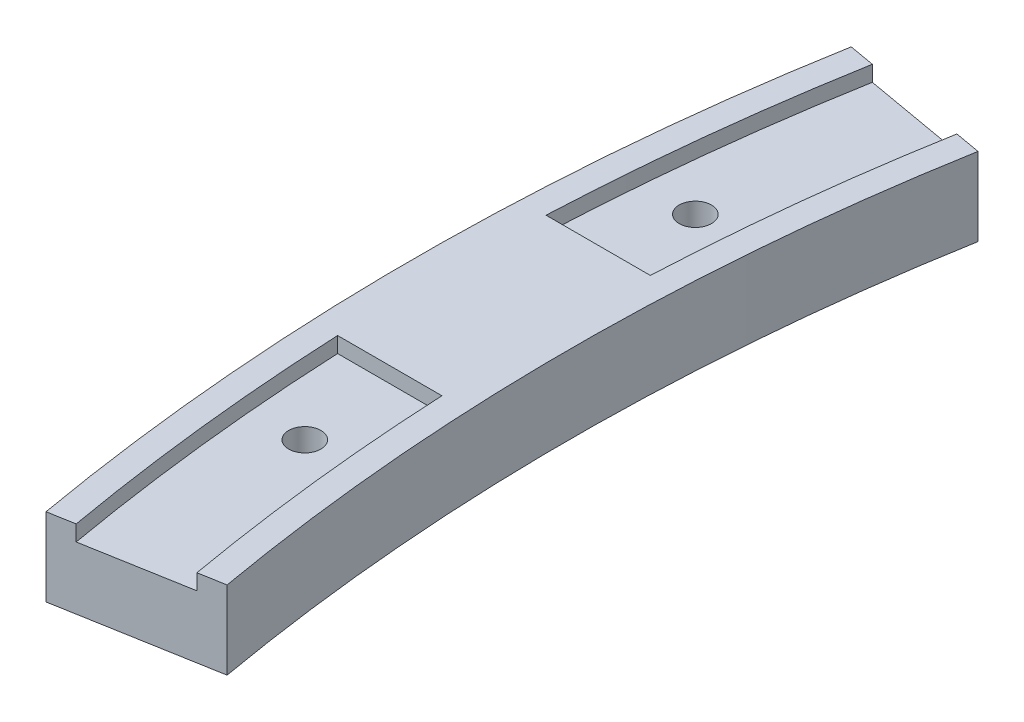
ISO-10303-21;
HEADER;
FILE_DESCRIPTION(('STEP AP214'),'2;1');
FILE_NAME('part.step','',(''),(''),'','','');
FILE_SCHEMA(('AUTOMOTIVE_DESIGN { 1 0 10303 214 1 1 1 1 }'));
ENDSEC;
DATA;
#1=APPLICATION_CONTEXT('core data for automotive mechanical design processes');
#2=APPLICATION_PROTOCOL_DEFINITION('international standard','automotive_design',2000,#1);
#3=PRODUCT_CONTEXT('',#1,'mechanical');
#4=PRODUCT('Part','Part','',(#3));
#5=PRODUCT_RELATED_PRODUCT_CATEGORY('part','',(#4));
#6=PRODUCT_DEFINITION_FORMATION('','',#4);
#7=PRODUCT_DEFINITION_CONTEXT('part definition',#1,'design');
#8=PRODUCT_DEFINITION('design','',#6,#7);
#9=PRODUCT_DEFINITION_SHAPE('','',#8);
#10=(LENGTH_UNIT() NAMED_UNIT(*) SI_UNIT(.MILLI.,.METRE.));
#11=(NAMED_UNIT(*) PLANE_ANGLE_UNIT() SI_UNIT($,.RADIAN.));
#12=(NAMED_UNIT(*) SI_UNIT($,.STERADIAN.) SOLID_ANGLE_UNIT());
#13=UNCERTAINTY_MEASURE_WITH_UNIT(LENGTH_MEASURE(1.E-05),#10,'distance_accuracy_value','');
#14=(GEOMETRIC_REPRESENTATION_CONTEXT(3) GLOBAL_UNCERTAINTY_ASSIGNED_CONTEXT((#13)) GLOBAL_UNIT_ASSIGNED_CONTEXT((#10,
#11,#12)) REPRESENTATION_CONTEXT('',''));
#15=CARTESIAN_POINT('',(0.,0.,0.));
#16=DIRECTION('',(0.,0.,1.));
#17=DIRECTION('',(1.,0.,0.));
#18=AXIS2_PLACEMENT_3D('',#15,#16,#17);
#19=CARTESIAN_POINT('',(-204.347608750033,7.5,36.0319968658881));
#20=DIRECTION('',(-0.173648177666931,0.,-0.984807753012208));
#21=DIRECTION('',(-0.984807753012208,0.,0.173648177666931));
#22=AXIS2_PLACEMENT_3D('',#19,#20,#21);
#23=PLANE('',#22);
#24=DIRECTION('',(0.,1.,0.));
#25=VECTOR('',#24,1.);
#26=CARTESIAN_POINT('',(-206.809628132564,6.,36.4661173100556));
#27=LINE('',#26,#25);
#28=CARTESIAN_POINT('',(-206.809628132564,6.,36.4661173100556));
#29=VERTEX_POINT('',#28);
#30=CARTESIAN_POINT('',(-206.809628132564,7.5,36.4661173100556));
#31=VERTEX_POINT('',#30);
#32=EDGE_CURVE('E158',#29,#31,#27,.T.);
#33=ORIENTED_EDGE('',*,*,#32,.F.);
#34=DIRECTION('',(0.984807753012208,0.,-0.173648177666931));
#35=VECTOR('',#34,1.);
#36=CARTESIAN_POINT('',(0.,6.,0.));
#37=LINE('',#36,#35);
#38=CARTESIAN_POINT('',(-216.657705662686,6.,38.2025990867249));
#39=VERTEX_POINT('',#38);
#40=EDGE_CURVE('E176',#39,#29,#37,.T.);
#41=ORIENTED_EDGE('',*,*,#40,.F.);
#42=DIRECTION('',(0.,1.,0.));
#43=VECTOR('',#42,1.);
#44=CARTESIAN_POINT('',(-216.657705662686,6.,38.2025990867249));
#45=LINE('',#44,#43);
#46=CARTESIAN_POINT('',(-216.657705662686,7.5,38.2025990867249));
#47=VERTEX_POINT('',#46);
#48=EDGE_CURVE('E186',#39,#47,#45,.T.);
#49=ORIENTED_EDGE('',*,*,#48,.T.);
#50=DIRECTION('',(0.984807753012208,0.,-0.173648177666931));
#51=VECTOR('',#50,1.);
#52=CARTESIAN_POINT('',(-204.347608750033,7.5,36.0319968658881));
#53=LINE('',#52,#51);
#54=CARTESIAN_POINT('',(-219.119725045216,7.5,38.6367195308921));
#55=VERTEX_POINT('',#54);
#56=EDGE_CURVE('E197',#55,#47,#53,.T.);
#57=ORIENTED_EDGE('',*,*,#56,.F.);
#58=DIRECTION('',(0.,-1.,0.));
#59=VECTOR('',#58,1.);
#60=CARTESIAN_POINT('',(-219.119725045216,7.5,38.6367195308921));
#61=LINE('',#60,#59);
#62=CARTESIAN_POINT('',(-219.119725045216,0.,38.6367195308921));
#63=VERTEX_POINT('',#62);
#64=EDGE_CURVE('E11',#55,#63,#61,.T.);
#65=ORIENTED_EDGE('',*,*,#64,.T.);
#66=DIRECTION('',(0.984807753012208,0.,-0.173648177666931));
#67=VECTOR('',#66,1.);
#68=CARTESIAN_POINT('',(-204.347608750033,0.,36.0319968658881));
#69=LINE('',#68,#67);
#70=CARTESIAN_POINT('',(-204.347608750033,0.,36.0319968658881));
#71=VERTEX_POINT('',#70);
#72=EDGE_CURVE('E208',#63,#71,#69,.T.);
#73=ORIENTED_EDGE('',*,*,#72,.T.);
#74=DIRECTION('',(0.,-1.,0.));
#75=VECTOR('',#74,1.);
#76=CARTESIAN_POINT('',(-204.347608750033,7.5,36.0319968658881));
#77=LINE('',#76,#75);
#78=CARTESIAN_POINT('',(-204.347608750033,7.5,36.0319968658881));
#79=VERTEX_POINT('',#78);
#80=EDGE_CURVE('E44',#79,#71,#77,.T.);
#81=ORIENTED_EDGE('',*,*,#80,.F.);
#82=EDGE_CURVE('E195',#31,#79,#53,.T.);
#83=ORIENTED_EDGE('',*,*,#82,.F.);
#84=EDGE_LOOP('',(#33,#41,#49,#57,#65,#73,#81,#83));
#85=FACE_BOUND('',#84,.T.);
#86=ADVANCED_FACE('F35',(#85),#23,.F.);
#87=CARTESIAN_POINT('',(-219.119725045216,7.5,-38.6367195308921));
#88=DIRECTION('',(-0.173648177666931,0.,0.984807753012208));
#89=DIRECTION('',(0.984807753012208,0.,0.173648177666931));
#90=AXIS2_PLACEMENT_3D('',#87,#88,#89);
#91=PLANE('',#90);
#92=DIRECTION('',(0.,1.,0.));
#93=VECTOR('',#92,1.);
#94=CARTESIAN_POINT('',(-206.809628132564,6.,-36.4661173100556));
#95=LINE('',#94,#93);
#96=CARTESIAN_POINT('',(-206.809628132564,6.,-36.4661173100556));
#97=VERTEX_POINT('',#96);
#98=CARTESIAN_POINT('',(-206.809628132564,7.5,-36.4661173100556));
#99=VERTEX_POINT('',#98);
#100=EDGE_CURVE('E127',#97,#99,#95,.T.);
#101=ORIENTED_EDGE('',*,*,#100,.T.);
#102=DIRECTION('',(-0.984807753012208,0.,-0.173648177666931));
#103=VECTOR('',#102,1.);
#104=CARTESIAN_POINT('',(-219.119725045216,7.5,-38.6367195308921));
#105=LINE('',#104,#103);
#106=CARTESIAN_POINT('',(-204.347608750033,7.5,-36.0319968658881));
#107=VERTEX_POINT('',#106);
#108=EDGE_CURVE('E203',#107,#99,#105,.T.);
#109=ORIENTED_EDGE('',*,*,#108,.F.);
#110=DIRECTION('',(0.,-1.,0.));
#111=VECTOR('',#110,1.);
#112=CARTESIAN_POINT('',(-204.347608750033,7.5,-36.0319968658881));
#113=LINE('',#112,#111);
#114=CARTESIAN_POINT('',(-204.347608750033,0.,-36.0319968658881));
#115=VERTEX_POINT('',#114);
#116=EDGE_CURVE('E215',#107,#115,#113,.T.);
#117=ORIENTED_EDGE('',*,*,#116,.T.);
#118=DIRECTION('',(-0.984807753012208,0.,-0.173648177666931));
#119=VECTOR('',#118,1.);
#120=CARTESIAN_POINT('',(-219.119725045216,0.,-38.6367195308921));
#121=LINE('',#120,#119);
#122=CARTESIAN_POINT('',(-219.119725045216,0.,-38.6367195308921));
#123=VERTEX_POINT('',#122);
#124=EDGE_CURVE('E196',#115,#123,#121,.T.);
#125=ORIENTED_EDGE('',*,*,#124,.T.);
#126=DIRECTION('',(0.,-1.,0.));
#127=VECTOR('',#126,1.);
#128=CARTESIAN_POINT('',(-219.119725045216,7.5,-38.6367195308921));
#129=LINE('',#128,#127);
#130=CARTESIAN_POINT('',(-219.119725045216,7.5,-38.6367195308921));
#131=VERTEX_POINT('',#130);
#132=EDGE_CURVE('E205',#131,#123,#129,.T.);
#133=ORIENTED_EDGE('',*,*,#132,.F.);
#134=CARTESIAN_POINT('',(-216.657705662686,7.5,-38.2025990867247));
#135=VERTEX_POINT('',#134);
#136=EDGE_CURVE('E202',#135,#131,#105,.T.);
#137=ORIENTED_EDGE('',*,*,#136,.F.);
#138=DIRECTION('',(0.,1.,0.));
#139=VECTOR('',#138,1.);
#140=CARTESIAN_POINT('',(-216.657705662686,6.,-38.2025990867249));
#141=LINE('',#140,#139);
#142=CARTESIAN_POINT('',(-216.657705662686,6.,-38.2025990867249));
#143=VERTEX_POINT('',#142);
#144=EDGE_CURVE('E59',#143,#135,#141,.T.);
#145=ORIENTED_EDGE('',*,*,#144,.F.);
#146=DIRECTION('',(-0.984807753012208,0.,-0.173648177666931));
#147=VECTOR('',#146,1.);
#148=CARTESIAN_POINT('',(0.,6.,0.));
#149=LINE('',#148,#147);
#150=EDGE_CURVE('E145',#97,#143,#149,.T.);
#151=ORIENTED_EDGE('',*,*,#150,.F.);
#152=EDGE_LOOP('',(#101,#109,#117,#125,#133,#137,#145,#151));
#153=FACE_BOUND('',#152,.T.);
#154=ADVANCED_FACE('F148',(#153),#91,.F.);
#155=CARTESIAN_POINT('',(0.,7.5,0.));
#156=DIRECTION('',(0.,1.,0.));
#157=DIRECTION('',(0.,0.,1.));
#158=AXIS2_PLACEMENT_3D('',#155,#156,#157);
#159=PLANE('',#158);
#160=ORIENTED_EDGE('',*,*,#108,.T.);
#161=CARTESIAN_POINT('',(0.,7.5,0.));
#162=DIRECTION('',(0.,1.,0.));
#163=DIRECTION('',(0.,0.,1.));
#164=AXIS2_PLACEMENT_3D('',#161,#162,#163);
#165=CIRCLE('',#164,210.);
#166=CARTESIAN_POINT('',(-209.76176963403,7.5,-9.99999999999995));
#167=VERTEX_POINT('',#166);
#168=EDGE_CURVE('E134',#99,#167,#165,.T.);
#169=ORIENTED_EDGE('',*,*,#168,.T.);
#170=DIRECTION('',(-1.,0.,0.));
#171=VECTOR('',#170,1.);
#172=CARTESIAN_POINT('',(0.,7.5,-10.0000000000001));
#173=LINE('',#172,#171);
#174=CARTESIAN_POINT('',(-219.772609758359,7.5,-9.99999999999995));
#175=VERTEX_POINT('',#174);
#176=EDGE_CURVE('E146',#167,#175,#173,.T.);
#177=ORIENTED_EDGE('',*,*,#176,.T.);
#178=CARTESIAN_POINT('',(0.,7.5,0.));
#179=DIRECTION('',(0.,1.,0.));
#180=DIRECTION('',(0.,0.,1.));
#181=AXIS2_PLACEMENT_3D('',#178,#179,#180);
#182=CIRCLE('',#181,220.);
#183=EDGE_CURVE('E157',#135,#175,#182,.T.);
#184=ORIENTED_EDGE('',*,*,#183,.F.);
#185=ORIENTED_EDGE('',*,*,#136,.T.);
#186=CARTESIAN_POINT('',(0.,7.5,0.));
#187=DIRECTION('',(0.,1.,0.));
#188=DIRECTION('',(0.,0.,1.));
#189=AXIS2_PLACEMENT_3D('',#186,#187,#188);
#190=CIRCLE('',#189,222.5);
#191=EDGE_CURVE('E192',#131,#55,#190,.T.);
#192=ORIENTED_EDGE('',*,*,#191,.T.);
#193=ORIENTED_EDGE('',*,*,#56,.T.);
#194=CARTESIAN_POINT('',(0.,7.5,0.));
#195=DIRECTION('',(0.,1.,0.));
#196=DIRECTION('',(0.,0.,1.));
#197=AXIS2_PLACEMENT_3D('',#194,#195,#196);
#198=CIRCLE('',#197,220.);
#199=CARTESIAN_POINT('',(-219.772609758359,7.5,10.));
#200=VERTEX_POINT('',#199);
#201=EDGE_CURVE('E171',#200,#47,#198,.T.);
#202=ORIENTED_EDGE('',*,*,#201,.F.);
#203=DIRECTION('',(1.,0.,0.));
#204=VECTOR('',#203,1.);
#205=CARTESIAN_POINT('',(0.,7.5,10.0000000000001));
#206=LINE('',#205,#204);
#207=CARTESIAN_POINT('',(-209.76176963403,7.5,10.));
#208=VERTEX_POINT('',#207);
#209=EDGE_CURVE('E181',#200,#208,#206,.T.);
#210=ORIENTED_EDGE('',*,*,#209,.T.);
#211=CARTESIAN_POINT('',(0.,7.5,0.));
#212=DIRECTION('',(0.,1.,0.));
#213=DIRECTION('',(0.,0.,1.));
#214=AXIS2_PLACEMENT_3D('',#211,#212,#213);
#215=CIRCLE('',#214,210.);
#216=EDGE_CURVE('E51',#208,#31,#215,.T.);
#217=ORIENTED_EDGE('',*,*,#216,.T.);
#218=ORIENTED_EDGE('',*,*,#82,.T.);
#219=CARTESIAN_POINT('',(0.,7.5,0.));
#220=DIRECTION('',(0.,-1.,0.));
#221=DIRECTION('',(0.,0.,1.));
#222=AXIS2_PLACEMENT_3D('',#219,#220,#221);
#223=CIRCLE('',#222,207.5);
#224=EDGE_CURVE('E200',#79,#107,#223,.T.);
#225=ORIENTED_EDGE('',*,*,#224,.T.);
#226=EDGE_LOOP('',(#160,#169,#177,#184,#185,#192,#193,#202,#210,#217,#218,#225));
#227=FACE_BOUND('',#226,.T.);
#228=ADVANCED_FACE('F236',(#227),#159,.T.);
#229=CARTESIAN_POINT('',(0.,7.5,0.));
#230=DIRECTION('',(0.,-1.,0.));
#231=DIRECTION('',(0.,0.,-1.));
#232=AXIS2_PLACEMENT_3D('',#229,#230,#231);
#233=CYLINDRICAL_SURFACE('',#232,222.5);
#234=CARTESIAN_POINT('',(0.,0.,0.));
#235=DIRECTION('',(0.,1.,0.));
#236=DIRECTION('',(0.,0.,1.));
#237=AXIS2_PLACEMENT_3D('',#234,#235,#236);
#238=CIRCLE('',#237,222.5);
#239=EDGE_CURVE('E164',#123,#63,#238,.T.);
#240=ORIENTED_EDGE('',*,*,#239,.T.);
#241=ORIENTED_EDGE('',*,*,#64,.F.);
#242=ORIENTED_EDGE('',*,*,#191,.F.);
#243=ORIENTED_EDGE('',*,*,#132,.T.);
#244=EDGE_LOOP('',(#240,#241,#242,#243));
#245=FACE_BOUND('',#244,.T.);
#246=ADVANCED_FACE('F37',(#245),#233,.T.);
#247=CARTESIAN_POINT('',(0.,7.5,0.));
#248=DIRECTION('',(0.,-1.,0.));
#249=DIRECTION('',(0.,0.,-1.));
#250=AXIS2_PLACEMENT_3D('',#247,#248,#249);
#251=CYLINDRICAL_SURFACE('',#250,207.5);
#252=CARTESIAN_POINT('',(0.,0.,0.));
#253=DIRECTION('',(0.,-1.,0.));
#254=DIRECTION('',(0.,0.,1.));
#255=AXIS2_PLACEMENT_3D('',#252,#253,#254);
#256=CIRCLE('',#255,207.5);
#257=EDGE_CURVE('E210',#71,#115,#256,.T.);
#258=ORIENTED_EDGE('',*,*,#257,.T.);
#259=ORIENTED_EDGE('',*,*,#116,.F.);
#260=ORIENTED_EDGE('',*,*,#224,.F.);
#261=ORIENTED_EDGE('',*,*,#80,.T.);
#262=EDGE_LOOP('',(#258,#259,#260,#261));
#263=FACE_BOUND('',#262,.T.);
#264=ADVANCED_FACE('F223',(#263),#251,.F.);
#265=CARTESIAN_POINT('',(0.,0.,0.));
#266=DIRECTION('',(0.,1.,0.));
#267=DIRECTION('',(0.,0.,1.));
#268=AXIS2_PLACEMENT_3D('',#265,#266,#267);
#269=PLANE('',#268);
#270=CARTESIAN_POINT('',(-214.181860089725,0.,18.7384846907465));
#271=DIRECTION('',(0.,-1.,0.));
#272=DIRECTION('',(0.,0.,-1.));
#273=AXIS2_PLACEMENT_3D('',#270,#271,#272);
#274=CIRCLE('',#273,1.55);
#275=CARTESIAN_POINT('',(-214.181860089725,0.,17.1884846907465));
#276=VERTEX_POINT('',#275);
#277=EDGE_CURVE('E366',#276,#276,#274,.T.);
#278=ORIENTED_EDGE('',*,*,#277,.F.);
#279=EDGE_LOOP('',(#278));
#280=FACE_BOUND('',#279,.T.);
#281=CARTESIAN_POINT('',(-214.181860089725,0.,-18.7384846907466));
#282=DIRECTION('',(0.,-1.,0.));
#283=DIRECTION('',(0.,0.,-1.));
#284=AXIS2_PLACEMENT_3D('',#281,#282,#283);
#285=CIRCLE('',#284,1.55);
#286=CARTESIAN_POINT('',(-214.181860089725,0.,-20.2884846907466));
#287=VERTEX_POINT('',#286);
#288=EDGE_CURVE('E368',#287,#287,#285,.T.);
#289=ORIENTED_EDGE('',*,*,#288,.F.);
#290=EDGE_LOOP('',(#289));
#291=FACE_BOUND('',#290,.T.);
#292=ORIENTED_EDGE('',*,*,#239,.F.);
#293=ORIENTED_EDGE('',*,*,#124,.F.);
#294=ORIENTED_EDGE('',*,*,#257,.F.);
#295=ORIENTED_EDGE('',*,*,#72,.F.);
#296=EDGE_LOOP('',(#292,#293,#294,#295));
#297=FACE_BOUND('',#296,.T.);
#298=ADVANCED_FACE('F230',(#280,#291,#297),#269,.F.);
#299=CARTESIAN_POINT('',(0.,6.,0.));
#300=DIRECTION('',(0.,1.,0.));
#301=DIRECTION('',(0.,0.,1.));
#302=AXIS2_PLACEMENT_3D('',#299,#300,#301);
#303=CYLINDRICAL_SURFACE('',#302,210.);
#304=ORIENTED_EDGE('',*,*,#216,.F.);
#305=DIRECTION('',(0.,1.,0.));
#306=VECTOR('',#305,1.);
#307=CARTESIAN_POINT('',(-209.76176963403,6.,10.));
#308=LINE('',#307,#306);
#309=CARTESIAN_POINT('',(-209.76176963403,6.,10.));
#310=VERTEX_POINT('',#309);
#311=EDGE_CURVE('E179',#310,#208,#308,.T.);
#312=ORIENTED_EDGE('',*,*,#311,.F.);
#313=CARTESIAN_POINT('',(0.,6.,0.));
#314=DIRECTION('',(0.,1.,0.));
#315=DIRECTION('',(0.,0.,1.));
#316=AXIS2_PLACEMENT_3D('',#313,#314,#315);
#317=CIRCLE('',#316,210.);
#318=EDGE_CURVE('E168',#310,#29,#317,.T.);
#319=ORIENTED_EDGE('',*,*,#318,.T.);
#320=ORIENTED_EDGE('',*,*,#32,.T.);
#321=EDGE_LOOP('',(#304,#312,#319,#320));
#322=FACE_BOUND('',#321,.T.);
#323=ADVANCED_FACE('F244',(#322),#303,.T.);
#324=CARTESIAN_POINT('',(0.,6.,0.));
#325=DIRECTION('',(0.,1.,0.));
#326=DIRECTION('',(0.,0.,1.));
#327=AXIS2_PLACEMENT_3D('',#324,#325,#326);
#328=CYLINDRICAL_SURFACE('',#327,220.);
#329=ORIENTED_EDGE('',*,*,#201,.T.);
#330=ORIENTED_EDGE('',*,*,#48,.F.);
#331=CARTESIAN_POINT('',(0.,6.,0.));
#332=DIRECTION('',(0.,1.,0.));
#333=DIRECTION('',(0.,0.,1.));
#334=AXIS2_PLACEMENT_3D('',#331,#332,#333);
#335=CIRCLE('',#334,220.);
#336=CARTESIAN_POINT('',(-219.772609758359,6.,10.));
#337=VERTEX_POINT('',#336);
#338=EDGE_CURVE('E173',#337,#39,#335,.T.);
#339=ORIENTED_EDGE('',*,*,#338,.F.);
#340=DIRECTION('',(0.,1.,0.));
#341=VECTOR('',#340,1.);
#342=CARTESIAN_POINT('',(-219.772609758359,6.,10.));
#343=LINE('',#342,#341);
#344=EDGE_CURVE('E189',#337,#200,#343,.T.);
#345=ORIENTED_EDGE('',*,*,#344,.T.);
#346=EDGE_LOOP('',(#329,#330,#339,#345));
#347=FACE_BOUND('',#346,.T.);
#348=ADVANCED_FACE('F251',(#347),#328,.F.);
#349=CARTESIAN_POINT('',(0.,6.,10.0000000000001));
#350=DIRECTION('',(0.,0.,1.));
#351=DIRECTION('',(1.,0.,0.));
#352=AXIS2_PLACEMENT_3D('',#349,#350,#351);
#353=PLANE('',#352);
#354=ORIENTED_EDGE('',*,*,#209,.F.);
#355=ORIENTED_EDGE('',*,*,#344,.F.);
#356=DIRECTION('',(1.,0.,0.));
#357=VECTOR('',#356,1.);
#358=CARTESIAN_POINT('',(0.,6.,10.0000000000001));
#359=LINE('',#358,#357);
#360=EDGE_CURVE('E170',#337,#310,#359,.T.);
#361=ORIENTED_EDGE('',*,*,#360,.T.);
#362=ORIENTED_EDGE('',*,*,#311,.T.);
#363=EDGE_LOOP('',(#354,#355,#361,#362));
#364=FACE_BOUND('',#363,.T.);
#365=ADVANCED_FACE('F254',(#364),#353,.T.);
#366=CARTESIAN_POINT('',(0.,6.,0.));
#367=DIRECTION('',(0.,1.,0.));
#368=DIRECTION('',(0.,0.,1.));
#369=AXIS2_PLACEMENT_3D('',#366,#367,#368);
#370=PLANE('',#369);
#371=CARTESIAN_POINT('',(-214.181860089725,6.,18.7384846907465));
#372=DIRECTION('',(0.,1.,0.));
#373=DIRECTION('',(0.,0.,1.));
#374=AXIS2_PLACEMENT_3D('',#371,#372,#373);
#375=CIRCLE('',#374,1.55);
#376=CARTESIAN_POINT('',(-214.181860089725,6.,20.2884846907465));
#377=VERTEX_POINT('',#376);
#378=EDGE_CURVE('E363',#377,#377,#375,.T.);
#379=ORIENTED_EDGE('',*,*,#378,.F.);
#380=EDGE_LOOP('',(#379));
#381=FACE_BOUND('',#380,.T.);
#382=ORIENTED_EDGE('',*,*,#318,.F.);
#383=ORIENTED_EDGE('',*,*,#360,.F.);
#384=ORIENTED_EDGE('',*,*,#338,.T.);
#385=ORIENTED_EDGE('',*,*,#40,.T.);
#386=EDGE_LOOP('',(#382,#383,#384,#385));
#387=FACE_BOUND('',#386,.T.);
#388=ADVANCED_FACE('F248',(#381,#387),#370,.T.);
#389=CARTESIAN_POINT('',(0.,6.,0.));
#390=DIRECTION('',(0.,1.,0.));
#391=DIRECTION('',(0.,0.,1.));
#392=AXIS2_PLACEMENT_3D('',#389,#390,#391);
#393=CYLINDRICAL_SURFACE('',#392,210.);
#394=ORIENTED_EDGE('',*,*,#168,.F.);
#395=ORIENTED_EDGE('',*,*,#100,.F.);
#396=CARTESIAN_POINT('',(0.,6.,0.));
#397=DIRECTION('',(0.,1.,0.));
#398=DIRECTION('',(0.,0.,1.));
#399=AXIS2_PLACEMENT_3D('',#396,#397,#398);
#400=CIRCLE('',#399,210.);
#401=CARTESIAN_POINT('',(-209.76176963403,6.,-9.99999999999995));
#402=VERTEX_POINT('',#401);
#403=EDGE_CURVE('E131',#97,#402,#400,.T.);
#404=ORIENTED_EDGE('',*,*,#403,.T.);
#405=DIRECTION('',(0.,1.,0.));
#406=VECTOR('',#405,1.);
#407=CARTESIAN_POINT('',(-209.76176963403,6.,-9.99999999999995));
#408=LINE('',#407,#406);
#409=EDGE_CURVE('E162',#402,#167,#408,.T.);
#410=ORIENTED_EDGE('',*,*,#409,.T.);
#411=EDGE_LOOP('',(#394,#395,#404,#410));
#412=FACE_BOUND('',#411,.T.);
#413=ADVANCED_FACE('F129',(#412),#393,.T.);
#414=CARTESIAN_POINT('',(0.,6.,-10.0000000000001));
#415=DIRECTION('',(0.,0.,-1.));
#416=DIRECTION('',(-1.,0.,0.));
#417=AXIS2_PLACEMENT_3D('',#414,#415,#416);
#418=PLANE('',#417);
#419=ORIENTED_EDGE('',*,*,#176,.F.);
#420=ORIENTED_EDGE('',*,*,#409,.F.);
#421=DIRECTION('',(-1.,0.,0.));
#422=VECTOR('',#421,1.);
#423=CARTESIAN_POINT('',(0.,6.,-10.0000000000001));
#424=LINE('',#423,#422);
#425=CARTESIAN_POINT('',(-219.772609758359,6.,-9.99999999999995));
#426=VERTEX_POINT('',#425);
#427=EDGE_CURVE('E139',#402,#426,#424,.T.);
#428=ORIENTED_EDGE('',*,*,#427,.T.);
#429=DIRECTION('',(0.,1.,0.));
#430=VECTOR('',#429,1.);
#431=CARTESIAN_POINT('',(-219.772609758359,6.,-9.99999999999995));
#432=LINE('',#431,#430);
#433=EDGE_CURVE('E165',#426,#175,#432,.T.);
#434=ORIENTED_EDGE('',*,*,#433,.T.);
#435=EDGE_LOOP('',(#419,#420,#428,#434));
#436=FACE_BOUND('',#435,.T.);
#437=ADVANCED_FACE('F241',(#436),#418,.T.);
#438=CARTESIAN_POINT('',(0.,6.,0.));
#439=DIRECTION('',(0.,1.,0.));
#440=DIRECTION('',(0.,0.,1.));
#441=AXIS2_PLACEMENT_3D('',#438,#439,#440);
#442=CYLINDRICAL_SURFACE('',#441,220.);
#443=ORIENTED_EDGE('',*,*,#183,.T.);
#444=ORIENTED_EDGE('',*,*,#433,.F.);
#445=CARTESIAN_POINT('',(0.,6.,0.));
#446=DIRECTION('',(0.,1.,0.));
#447=DIRECTION('',(0.,0.,1.));
#448=AXIS2_PLACEMENT_3D('',#445,#446,#447);
#449=CIRCLE('',#448,220.);
#450=EDGE_CURVE('E150',#143,#426,#449,.T.);
#451=ORIENTED_EDGE('',*,*,#450,.F.);
#452=ORIENTED_EDGE('',*,*,#144,.T.);
#453=EDGE_LOOP('',(#443,#444,#451,#452));
#454=FACE_BOUND('',#453,.T.);
#455=ADVANCED_FACE('F239',(#454),#442,.F.);
#456=CARTESIAN_POINT('',(0.,6.,0.));
#457=DIRECTION('',(0.,1.,0.));
#458=DIRECTION('',(0.,0.,1.));
#459=AXIS2_PLACEMENT_3D('',#456,#457,#458);
#460=PLANE('',#459);
#461=CARTESIAN_POINT('',(-214.181860089725,6.,-18.7384846907466));
#462=DIRECTION('',(0.,1.,0.));
#463=DIRECTION('',(0.,0.,1.));
#464=AXIS2_PLACEMENT_3D('',#461,#462,#463);
#465=CIRCLE('',#464,1.55);
#466=CARTESIAN_POINT('',(-214.181860089725,6.,-17.1884846907466));
#467=VERTEX_POINT('',#466);
#468=EDGE_CURVE('E39',#467,#467,#465,.T.);
#469=ORIENTED_EDGE('',*,*,#468,.F.);
#470=EDGE_LOOP('',(#469));
#471=FACE_BOUND('',#470,.T.);
#472=ORIENTED_EDGE('',*,*,#403,.F.);
#473=ORIENTED_EDGE('',*,*,#150,.T.);
#474=ORIENTED_EDGE('',*,*,#450,.T.);
#475=ORIENTED_EDGE('',*,*,#427,.F.);
#476=EDGE_LOOP('',(#472,#473,#474,#475));
#477=FACE_BOUND('',#476,.T.);
#478=ADVANCED_FACE('F143',(#471,#477),#460,.T.);
#479=CARTESIAN_POINT('',(-214.181860089725,0.,-18.7384846907466));
#480=DIRECTION('',(0.,-1.,0.));
#481=DIRECTION('',(0.,0.,-1.));
#482=AXIS2_PLACEMENT_3D('',#479,#480,#481);
#483=CYLINDRICAL_SURFACE('',#482,1.55);
#484=ORIENTED_EDGE('',*,*,#468,.T.);
#485=EDGE_LOOP('',(#484));
#486=FACE_BOUND('',#485,.T.);
#487=ORIENTED_EDGE('',*,*,#288,.T.);
#488=EDGE_LOOP('',(#487));
#489=FACE_BOUND('',#488,.T.);
#490=ADVANCED_FACE('F336',(#486,#489),#483,.F.);
#491=CARTESIAN_POINT('',(-214.181860089725,0.,18.7384846907465));
#492=DIRECTION('',(0.,-1.,0.));
#493=DIRECTION('',(0.,0.,-1.));
#494=AXIS2_PLACEMENT_3D('',#491,#492,#493);
#495=CYLINDRICAL_SURFACE('',#494,1.55);
#496=ORIENTED_EDGE('',*,*,#378,.T.);
#497=EDGE_LOOP('',(#496));
#498=FACE_BOUND('',#497,.T.);
#499=ORIENTED_EDGE('',*,*,#277,.T.);
#500=EDGE_LOOP('',(#499));
#501=FACE_BOUND('',#500,.T.);
#502=ADVANCED_FACE('F346',(#498,#501),#495,.F.);
#503=CLOSED_SHELL('',(#86,#154,#228,#246,#264,#298,#323,#348,#365,#388,#413,#437,#455,#478,#490,#502));
#504=MANIFOLD_SOLID_BREP('B2',#503);
#505=ADVANCED_BREP_SHAPE_REPRESENTATION('',(#18,#504),#14);
#506=SHAPE_DEFINITION_REPRESENTATION(#9,#505);
ENDSEC;
END-ISO-10303-21;
